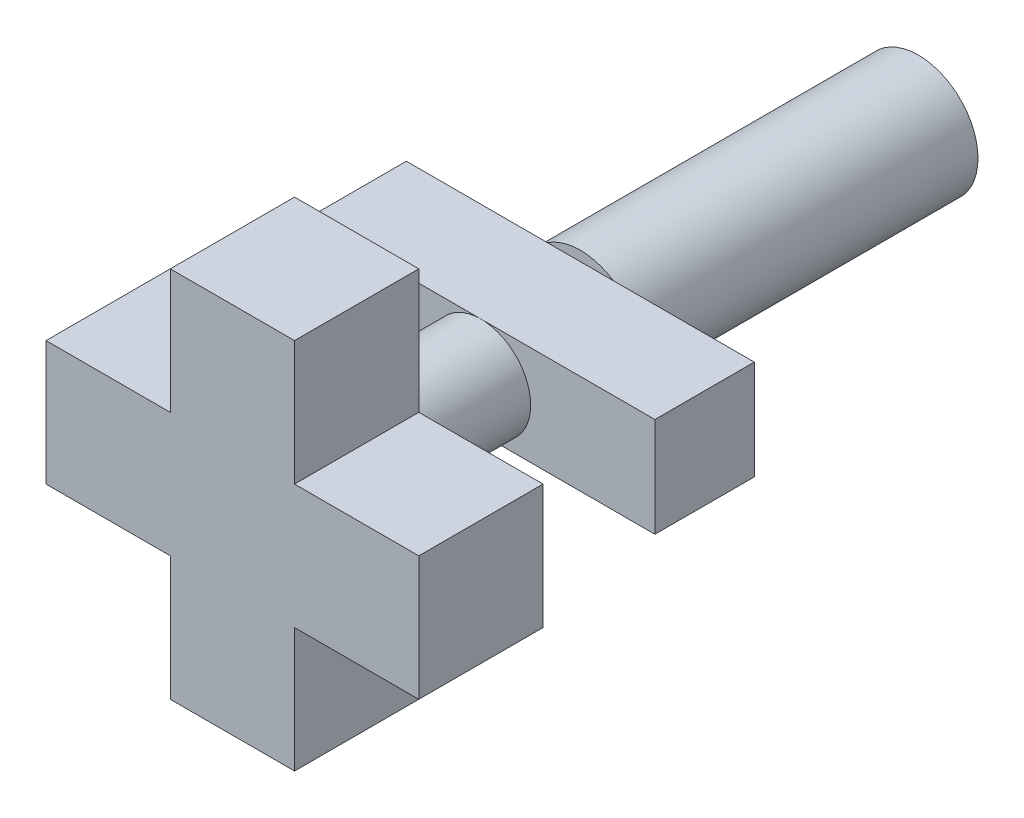
ISO-10303-21;
HEADER;
FILE_DESCRIPTION(('STEP AP214'),'2;1');
FILE_NAME('part.step','',(''),(''),'','','');
FILE_SCHEMA(('AUTOMOTIVE_DESIGN { 1 0 10303 214 1 1 1 1 }'));
ENDSEC;
DATA;
#1=APPLICATION_CONTEXT('core data for automotive mechanical design processes');
#2=APPLICATION_PROTOCOL_DEFINITION('international standard','automotive_design',2000,#1);
#3=PRODUCT_CONTEXT('',#1,'mechanical');
#4=PRODUCT('Part','Part','',(#3));
#5=PRODUCT_RELATED_PRODUCT_CATEGORY('part','',(#4));
#6=PRODUCT_DEFINITION_FORMATION('','',#4);
#7=PRODUCT_DEFINITION_CONTEXT('part definition',#1,'design');
#8=PRODUCT_DEFINITION('design','',#6,#7);
#9=PRODUCT_DEFINITION_SHAPE('','',#8);
#10=(LENGTH_UNIT() NAMED_UNIT(*) SI_UNIT(.MILLI.,.METRE.));
#11=(NAMED_UNIT(*) PLANE_ANGLE_UNIT() SI_UNIT($,.RADIAN.));
#12=(NAMED_UNIT(*) SI_UNIT($,.STERADIAN.) SOLID_ANGLE_UNIT());
#13=UNCERTAINTY_MEASURE_WITH_UNIT(LENGTH_MEASURE(1.E-05),#10,'distance_accuracy_value','');
#14=(GEOMETRIC_REPRESENTATION_CONTEXT(3) GLOBAL_UNCERTAINTY_ASSIGNED_CONTEXT((#13)) GLOBAL_UNIT_ASSIGNED_CONTEXT((#10,
#11,#12)) REPRESENTATION_CONTEXT('',''));
#15=CARTESIAN_POINT('',(0.,0.,0.));
#16=DIRECTION('',(0.,0.,1.));
#17=DIRECTION('',(1.,0.,0.));
#18=AXIS2_PLACEMENT_3D('',#15,#16,#17);
#19=CARTESIAN_POINT('',(0.,0.,22.352));
#20=DIRECTION('',(0.,0.,-1.));
#21=DIRECTION('',(-1.,0.,0.));
#22=AXIS2_PLACEMENT_3D('',#19,#20,#21);
#23=PLANE('',#22);
#24=CARTESIAN_POINT('',(0.,0.,22.352));
#25=DIRECTION('',(0.,0.,1.));
#26=DIRECTION('',(1.,0.,0.));
#27=AXIS2_PLACEMENT_3D('',#24,#25,#26);
#28=CIRCLE('',#27,2.54);
#29=CARTESIAN_POINT('',(0.,2.54,22.352));
#30=VERTEX_POINT('',#29);
#31=CARTESIAN_POINT('',(0.,-2.54,22.352));
#32=VERTEX_POINT('',#31);
#33=EDGE_CURVE('E61',#30,#32,#28,.T.);
#34=ORIENTED_EDGE('',*,*,#33,.F.);
#35=DIRECTION('',(-1.,0.,0.));
#36=VECTOR('',#35,1.);
#37=CARTESIAN_POINT('',(-8.89,2.54,22.352));
#38=LINE('',#37,#36);
#39=CARTESIAN_POINT('',(-8.89,2.54,22.352));
#40=VERTEX_POINT('',#39);
#41=EDGE_CURVE('E229',#30,#40,#38,.T.);
#42=ORIENTED_EDGE('',*,*,#41,.T.);
#43=DIRECTION('',(0.,-1.,0.));
#44=VECTOR('',#43,1.);
#45=CARTESIAN_POINT('',(-8.89,-2.54,22.352));
#46=LINE('',#45,#44);
#47=CARTESIAN_POINT('',(-8.89,-2.54,22.352));
#48=VERTEX_POINT('',#47);
#49=EDGE_CURVE('E234',#40,#48,#46,.T.);
#50=ORIENTED_EDGE('',*,*,#49,.T.);
#51=DIRECTION('',(1.,0.,0.));
#52=VECTOR('',#51,1.);
#53=CARTESIAN_POINT('',(-8.89,-2.54,22.352));
#54=LINE('',#53,#52);
#55=EDGE_CURVE('E238',#48,#32,#54,.T.);
#56=ORIENTED_EDGE('',*,*,#55,.T.);
#57=EDGE_LOOP('',(#34,#42,#50,#56));
#58=FACE_BOUND('',#57,.T.);
#59=ADVANCED_FACE('F49',(#58),#23,.F.);
#60=CARTESIAN_POINT('',(0.,0.,17.272));
#61=DIRECTION('',(0.,0.,1.));
#62=DIRECTION('',(1.,0.,0.));
#63=AXIS2_PLACEMENT_3D('',#60,#61,#62);
#64=PLANE('',#63);
#65=DIRECTION('',(1.,0.,0.));
#66=VECTOR('',#65,1.);
#67=CARTESIAN_POINT('',(-8.89,-2.54,17.272));
#68=LINE('',#67,#66);
#69=CARTESIAN_POINT('',(-1.68484539350054,-2.54,17.272));
#70=VERTEX_POINT('',#69);
#71=CARTESIAN_POINT('',(1.68484539350054,-2.54,17.272));
#72=VERTEX_POINT('',#71);
#73=EDGE_CURVE('E59',#70,#72,#68,.T.);
#74=ORIENTED_EDGE('',*,*,#73,.F.);
#75=CARTESIAN_POINT('',(0.,0.,17.272));
#76=DIRECTION('',(0.,0.,1.));
#77=DIRECTION('',(1.,0.,0.));
#78=AXIS2_PLACEMENT_3D('',#75,#76,#77);
#79=CIRCLE('',#78,3.048);
#80=EDGE_CURVE('E282',#70,#72,#79,.T.);
#81=ORIENTED_EDGE('',*,*,#80,.T.);
#82=EDGE_LOOP('',(#74,#81));
#83=FACE_BOUND('',#82,.T.);
#84=ADVANCED_FACE('F305',(#83),#64,.T.);
#85=CARTESIAN_POINT('',(0.,0.,17.272));
#86=DIRECTION('',(0.,0.,-1.));
#87=DIRECTION('',(-1.,0.,0.));
#88=AXIS2_PLACEMENT_3D('',#85,#86,#87);
#89=CYLINDRICAL_SURFACE('',#88,3.048);
#90=CARTESIAN_POINT('',(1.68484539350054,2.54,17.272));
#91=VERTEX_POINT('',#90);
#92=CARTESIAN_POINT('',(-1.68484539350054,2.54,17.272));
#93=VERTEX_POINT('',#92);
#94=EDGE_CURVE('E273',#91,#93,#79,.T.);
#95=ORIENTED_EDGE('',*,*,#94,.F.);
#96=EDGE_CURVE('E74',#72,#91,#79,.T.);
#97=ORIENTED_EDGE('',*,*,#96,.F.);
#98=ORIENTED_EDGE('',*,*,#80,.F.);
#99=EDGE_CURVE('E275',#93,#70,#79,.T.);
#100=ORIENTED_EDGE('',*,*,#99,.F.);
#101=EDGE_LOOP('',(#95,#97,#98,#100));
#102=FACE_BOUND('',#101,.T.);
#103=CARTESIAN_POINT('',(0.,0.,0.));
#104=DIRECTION('',(0.,0.,1.));
#105=DIRECTION('',(1.,0.,0.));
#106=AXIS2_PLACEMENT_3D('',#103,#104,#105);
#107=CIRCLE('',#106,3.048);
#108=CARTESIAN_POINT('',(3.048,0.,0.));
#109=VERTEX_POINT('',#108);
#110=EDGE_CURVE('E53',#109,#109,#107,.T.);
#111=ORIENTED_EDGE('',*,*,#110,.T.);
#112=EDGE_LOOP('',(#111));
#113=FACE_BOUND('',#112,.T.);
#114=ADVANCED_FACE('F51',(#102,#113),#89,.T.);
#115=DIRECTION('',(-1.,0.,0.));
#116=VECTOR('',#115,1.);
#117=CARTESIAN_POINT('',(-8.89,2.54,17.272));
#118=LINE('',#117,#116);
#119=EDGE_CURVE('E252',#91,#93,#118,.T.);
#120=ORIENTED_EDGE('',*,*,#119,.F.);
#121=ORIENTED_EDGE('',*,*,#94,.T.);
#122=EDGE_LOOP('',(#120,#121));
#123=FACE_BOUND('',#122,.T.);
#124=ADVANCED_FACE('F295',(#123),#64,.T.);
#125=CARTESIAN_POINT('',(0.,0.,0.));
#126=DIRECTION('',(0.,0.,1.));
#127=DIRECTION('',(1.,0.,0.));
#128=AXIS2_PLACEMENT_3D('',#125,#126,#127);
#129=PLANE('',#128);
#130=ORIENTED_EDGE('',*,*,#110,.F.);
#131=EDGE_LOOP('',(#130));
#132=FACE_BOUND('',#131,.T.);
#133=ADVANCED_FACE('F292',(#132),#129,.F.);
#134=CARTESIAN_POINT('',(0.,0.,17.272));
#135=DIRECTION('',(0.,0.,-1.));
#136=DIRECTION('',(-1.,0.,0.));
#137=AXIS2_PLACEMENT_3D('',#134,#135,#136);
#138=PLANE('',#137);
#139=CARTESIAN_POINT('',(-8.89,2.54,17.272));
#140=VERTEX_POINT('',#139);
#141=EDGE_CURVE('E246',#93,#140,#118,.T.);
#142=ORIENTED_EDGE('',*,*,#141,.F.);
#143=ORIENTED_EDGE('',*,*,#99,.T.);
#144=CARTESIAN_POINT('',(-8.89,-2.54,17.272));
#145=VERTEX_POINT('',#144);
#146=EDGE_CURVE('E230',#145,#70,#68,.T.);
#147=ORIENTED_EDGE('',*,*,#146,.F.);
#148=DIRECTION('',(0.,-1.,0.));
#149=VECTOR('',#148,1.);
#150=CARTESIAN_POINT('',(-8.89,-2.54,17.272));
#151=LINE('',#150,#149);
#152=EDGE_CURVE('E251',#140,#145,#151,.T.);
#153=ORIENTED_EDGE('',*,*,#152,.F.);
#154=EDGE_LOOP('',(#142,#143,#147,#153));
#155=FACE_BOUND('',#154,.T.);
#156=ADVANCED_FACE('F294',(#155),#138,.T.);
#157=CARTESIAN_POINT('',(8.89,-2.54,22.352));
#158=DIRECTION('',(-1.,0.,0.));
#159=DIRECTION('',(0.,0.,1.));
#160=AXIS2_PLACEMENT_3D('',#157,#158,#159);
#161=PLANE('',#160);
#162=DIRECTION('',(0.,1.,0.));
#163=VECTOR('',#162,1.);
#164=CARTESIAN_POINT('',(8.89,-2.54,17.272));
#165=LINE('',#164,#163);
#166=CARTESIAN_POINT('',(8.89,-2.54,17.272));
#167=VERTEX_POINT('',#166);
#168=CARTESIAN_POINT('',(8.89,2.54,17.272));
#169=VERTEX_POINT('',#168);
#170=EDGE_CURVE('E223',#167,#169,#165,.T.);
#171=ORIENTED_EDGE('',*,*,#170,.T.);
#172=DIRECTION('',(0.,0.,-1.));
#173=VECTOR('',#172,1.);
#174=CARTESIAN_POINT('',(8.89,2.54,22.352));
#175=LINE('',#174,#173);
#176=CARTESIAN_POINT('',(8.89,2.54,22.352));
#177=VERTEX_POINT('',#176);
#178=EDGE_CURVE('E270',#177,#169,#175,.T.);
#179=ORIENTED_EDGE('',*,*,#178,.F.);
#180=DIRECTION('',(0.,1.,0.));
#181=VECTOR('',#180,1.);
#182=CARTESIAN_POINT('',(8.89,-2.54,22.352));
#183=LINE('',#182,#181);
#184=CARTESIAN_POINT('',(8.89,-2.54,22.352));
#185=VERTEX_POINT('',#184);
#186=EDGE_CURVE('E225',#185,#177,#183,.T.);
#187=ORIENTED_EDGE('',*,*,#186,.F.);
#188=DIRECTION('',(0.,0.,-1.));
#189=VECTOR('',#188,1.);
#190=CARTESIAN_POINT('',(8.89,-2.54,22.352));
#191=LINE('',#190,#189);
#192=EDGE_CURVE('E242',#185,#167,#191,.T.);
#193=ORIENTED_EDGE('',*,*,#192,.T.);
#194=EDGE_LOOP('',(#171,#179,#187,#193));
#195=FACE_BOUND('',#194,.T.);
#196=ADVANCED_FACE('F300',(#195),#161,.F.);
#197=CARTESIAN_POINT('',(-8.89,2.54,22.352));
#198=DIRECTION('',(0.,-1.,0.));
#199=DIRECTION('',(0.,0.,-1.));
#200=AXIS2_PLACEMENT_3D('',#197,#198,#199);
#201=PLANE('',#200);
#202=EDGE_CURVE('E247',#169,#91,#118,.T.);
#203=ORIENTED_EDGE('',*,*,#202,.T.);
#204=ORIENTED_EDGE('',*,*,#119,.T.);
#205=ORIENTED_EDGE('',*,*,#141,.T.);
#206=DIRECTION('',(0.,0.,-1.));
#207=VECTOR('',#206,1.);
#208=CARTESIAN_POINT('',(-8.89,2.54,22.352));
#209=LINE('',#208,#207);
#210=EDGE_CURVE('E266',#40,#140,#209,.T.);
#211=ORIENTED_EDGE('',*,*,#210,.F.);
#212=ORIENTED_EDGE('',*,*,#41,.F.);
#213=EDGE_CURVE('E231',#177,#30,#38,.T.);
#214=ORIENTED_EDGE('',*,*,#213,.F.);
#215=ORIENTED_EDGE('',*,*,#178,.T.);
#216=EDGE_LOOP('',(#203,#204,#205,#211,#212,#214,#215));
#217=FACE_BOUND('',#216,.T.);
#218=ADVANCED_FACE('F329',(#217),#201,.F.);
#219=CARTESIAN_POINT('',(-8.89,-2.54,22.352));
#220=DIRECTION('',(1.,0.,0.));
#221=DIRECTION('',(0.,0.,-1.));
#222=AXIS2_PLACEMENT_3D('',#219,#220,#221);
#223=PLANE('',#222);
#224=ORIENTED_EDGE('',*,*,#152,.T.);
#225=DIRECTION('',(0.,0.,-1.));
#226=VECTOR('',#225,1.);
#227=CARTESIAN_POINT('',(-8.89,-2.54,22.352));
#228=LINE('',#227,#226);
#229=EDGE_CURVE('E262',#48,#145,#228,.T.);
#230=ORIENTED_EDGE('',*,*,#229,.F.);
#231=ORIENTED_EDGE('',*,*,#49,.F.);
#232=ORIENTED_EDGE('',*,*,#210,.T.);
#233=EDGE_LOOP('',(#224,#230,#231,#232));
#234=FACE_BOUND('',#233,.T.);
#235=ADVANCED_FACE('F323',(#234),#223,.F.);
#236=CARTESIAN_POINT('',(-8.89,-2.54,22.352));
#237=DIRECTION('',(0.,1.,0.));
#238=DIRECTION('',(0.,0.,1.));
#239=AXIS2_PLACEMENT_3D('',#236,#237,#238);
#240=PLANE('',#239);
#241=ORIENTED_EDGE('',*,*,#146,.T.);
#242=ORIENTED_EDGE('',*,*,#73,.T.);
#243=EDGE_CURVE('E255',#72,#167,#68,.T.);
#244=ORIENTED_EDGE('',*,*,#243,.T.);
#245=ORIENTED_EDGE('',*,*,#192,.F.);
#246=EDGE_CURVE('E237',#32,#185,#54,.T.);
#247=ORIENTED_EDGE('',*,*,#246,.F.);
#248=ORIENTED_EDGE('',*,*,#55,.F.);
#249=ORIENTED_EDGE('',*,*,#229,.T.);
#250=EDGE_LOOP('',(#241,#242,#244,#245,#247,#248,#249));
#251=FACE_BOUND('',#250,.T.);
#252=ADVANCED_FACE('F317',(#251),#240,.F.);
#253=EDGE_CURVE('E11',#32,#30,#28,.T.);
#254=ORIENTED_EDGE('',*,*,#253,.F.);
#255=ORIENTED_EDGE('',*,*,#246,.T.);
#256=ORIENTED_EDGE('',*,*,#186,.T.);
#257=ORIENTED_EDGE('',*,*,#213,.T.);
#258=EDGE_LOOP('',(#254,#255,#256,#257));
#259=FACE_BOUND('',#258,.T.);
#260=ADVANCED_FACE('F309',(#259),#23,.F.);
#261=ORIENTED_EDGE('',*,*,#243,.F.);
#262=ORIENTED_EDGE('',*,*,#96,.T.);
#263=ORIENTED_EDGE('',*,*,#202,.F.);
#264=ORIENTED_EDGE('',*,*,#170,.F.);
#265=EDGE_LOOP('',(#261,#262,#263,#264));
#266=FACE_BOUND('',#265,.T.);
#267=ADVANCED_FACE('F303',(#266),#138,.T.);
#268=CARTESIAN_POINT('',(0.,0.,28.702));
#269=DIRECTION('',(0.,0.,-1.));
#270=DIRECTION('',(-1.,0.,0.));
#271=AXIS2_PLACEMENT_3D('',#268,#269,#270);
#272=CYLINDRICAL_SURFACE('',#271,2.54);
#273=CARTESIAN_POINT('',(0.,0.,28.702));
#274=DIRECTION('',(0.,0.,1.));
#275=DIRECTION('',(1.,0.,0.));
#276=AXIS2_PLACEMENT_3D('',#273,#274,#275);
#277=CIRCLE('',#276,2.54);
#278=CARTESIAN_POINT('',(2.54,0.,28.702));
#279=VERTEX_POINT('',#278);
#280=EDGE_CURVE('E216',#279,#279,#277,.T.);
#281=ORIENTED_EDGE('',*,*,#280,.F.);
#282=EDGE_LOOP('',(#281));
#283=FACE_BOUND('',#282,.T.);
#284=ORIENTED_EDGE('',*,*,#33,.T.);
#285=ORIENTED_EDGE('',*,*,#253,.T.);
#286=EDGE_LOOP('',(#284,#285));
#287=FACE_BOUND('',#286,.T.);
#288=ADVANCED_FACE('F322',(#283,#287),#272,.T.);
#289=CARTESIAN_POINT('',(3.175,3.175,35.052));
#290=DIRECTION('',(0.,-1.,0.));
#291=DIRECTION('',(0.,0.,-1.));
#292=AXIS2_PLACEMENT_3D('',#289,#290,#291);
#293=PLANE('',#292);
#294=DIRECTION('',(-1.,0.,0.));
#295=VECTOR('',#294,1.);
#296=CARTESIAN_POINT('',(3.175,3.175,28.702));
#297=LINE('',#296,#295);
#298=CARTESIAN_POINT('',(9.525,3.175,28.702));
#299=VERTEX_POINT('',#298);
#300=CARTESIAN_POINT('',(3.175,3.175,28.702));
#301=VERTEX_POINT('',#300);
#302=EDGE_CURVE('E210',#299,#301,#297,.T.);
#303=ORIENTED_EDGE('',*,*,#302,.T.);
#304=DIRECTION('',(0.,0.,-1.));
#305=VECTOR('',#304,1.);
#306=CARTESIAN_POINT('',(3.175,3.175,35.052));
#307=LINE('',#306,#305);
#308=CARTESIAN_POINT('',(3.175,3.175,35.052));
#309=VERTEX_POINT('',#308);
#310=EDGE_CURVE('E188',#309,#301,#307,.T.);
#311=ORIENTED_EDGE('',*,*,#310,.F.);
#312=DIRECTION('',(-1.,0.,0.));
#313=VECTOR('',#312,1.);
#314=CARTESIAN_POINT('',(3.175,3.175,35.052));
#315=LINE('',#314,#313);
#316=CARTESIAN_POINT('',(9.525,3.175,35.052));
#317=VERTEX_POINT('',#316);
#318=EDGE_CURVE('E196',#317,#309,#315,.T.);
#319=ORIENTED_EDGE('',*,*,#318,.F.);
#320=DIRECTION('',(0.,0.,-1.));
#321=VECTOR('',#320,1.);
#322=CARTESIAN_POINT('',(9.525,3.175,35.052));
#323=LINE('',#322,#321);
#324=EDGE_CURVE('E713',#317,#299,#323,.T.);
#325=ORIENTED_EDGE('',*,*,#324,.T.);
#326=EDGE_LOOP('',(#303,#311,#319,#325));
#327=FACE_BOUND('',#326,.T.);
#328=ADVANCED_FACE('F208',(#327),#293,.F.);
#329=CARTESIAN_POINT('',(3.175,3.175,35.052));
#330=DIRECTION('',(-1.,0.,0.));
#331=DIRECTION('',(0.,-1.,0.));
#332=AXIS2_PLACEMENT_3D('',#329,#330,#331);
#333=PLANE('',#332);
#334=DIRECTION('',(0.,1.,0.));
#335=VECTOR('',#334,1.);
#336=CARTESIAN_POINT('',(3.175,3.175,28.702));
#337=LINE('',#336,#335);
#338=CARTESIAN_POINT('',(3.175,9.525,28.702));
#339=VERTEX_POINT('',#338);
#340=EDGE_CURVE('E676',#301,#339,#337,.T.);
#341=ORIENTED_EDGE('',*,*,#340,.T.);
#342=DIRECTION('',(0.,0.,-1.));
#343=VECTOR('',#342,1.);
#344=CARTESIAN_POINT('',(3.175,9.525,35.052));
#345=LINE('',#344,#343);
#346=CARTESIAN_POINT('',(3.175,9.525,35.052));
#347=VERTEX_POINT('',#346);
#348=EDGE_CURVE('E191',#347,#339,#345,.T.);
#349=ORIENTED_EDGE('',*,*,#348,.F.);
#350=DIRECTION('',(0.,1.,0.));
#351=VECTOR('',#350,1.);
#352=CARTESIAN_POINT('',(3.175,3.175,35.052));
#353=LINE('',#352,#351);
#354=EDGE_CURVE('E184',#309,#347,#353,.T.);
#355=ORIENTED_EDGE('',*,*,#354,.F.);
#356=ORIENTED_EDGE('',*,*,#310,.T.);
#357=EDGE_LOOP('',(#341,#349,#355,#356));
#358=FACE_BOUND('',#357,.T.);
#359=ADVANCED_FACE('F186',(#358),#333,.F.);
#360=CARTESIAN_POINT('',(-3.175,9.525,35.052));
#361=DIRECTION('',(0.,-1.,0.));
#362=DIRECTION('',(0.,0.,-1.));
#363=AXIS2_PLACEMENT_3D('',#360,#361,#362);
#364=PLANE('',#363);
#365=DIRECTION('',(-1.,0.,0.));
#366=VECTOR('',#365,1.);
#367=CARTESIAN_POINT('',(-3.175,9.525,28.702));
#368=LINE('',#367,#366);
#369=CARTESIAN_POINT('',(-3.175,9.525,28.702));
#370=VERTEX_POINT('',#369);
#371=EDGE_CURVE('E680',#339,#370,#368,.T.);
#372=ORIENTED_EDGE('',*,*,#371,.T.);
#373=DIRECTION('',(0.,0.,-1.));
#374=VECTOR('',#373,1.);
#375=CARTESIAN_POINT('',(-3.175,9.525,35.052));
#376=LINE('',#375,#374);
#377=CARTESIAN_POINT('',(-3.175,9.525,35.052));
#378=VERTEX_POINT('',#377);
#379=EDGE_CURVE('E217',#378,#370,#376,.T.);
#380=ORIENTED_EDGE('',*,*,#379,.F.);
#381=DIRECTION('',(-1.,0.,0.));
#382=VECTOR('',#381,1.);
#383=CARTESIAN_POINT('',(-3.175,9.525,35.052));
#384=LINE('',#383,#382);
#385=EDGE_CURVE('E195',#347,#378,#384,.T.);
#386=ORIENTED_EDGE('',*,*,#385,.F.);
#387=ORIENTED_EDGE('',*,*,#348,.T.);
#388=EDGE_LOOP('',(#372,#380,#386,#387));
#389=FACE_BOUND('',#388,.T.);
#390=ADVANCED_FACE('F368',(#389),#364,.F.);
#391=CARTESIAN_POINT('',(-3.175,3.175,35.052));
#392=DIRECTION('',(1.,0.,0.));
#393=DIRECTION('',(0.,1.,0.));
#394=AXIS2_PLACEMENT_3D('',#391,#392,#393);
#395=PLANE('',#394);
#396=DIRECTION('',(0.,-1.,0.));
#397=VECTOR('',#396,1.);
#398=CARTESIAN_POINT('',(-3.175,3.175,28.702));
#399=LINE('',#398,#397);
#400=CARTESIAN_POINT('',(-3.175,3.175,28.702));
#401=VERTEX_POINT('',#400);
#402=EDGE_CURVE('E687',#370,#401,#399,.T.);
#403=ORIENTED_EDGE('',*,*,#402,.T.);
#404=DIRECTION('',(0.,0.,-1.));
#405=VECTOR('',#404,1.);
#406=CARTESIAN_POINT('',(-3.175,3.175,35.052));
#407=LINE('',#406,#405);
#408=CARTESIAN_POINT('',(-3.175,3.175,35.052));
#409=VERTEX_POINT('',#408);
#410=EDGE_CURVE('E744',#409,#401,#407,.T.);
#411=ORIENTED_EDGE('',*,*,#410,.F.);
#412=DIRECTION('',(0.,-1.,0.));
#413=VECTOR('',#412,1.);
#414=CARTESIAN_POINT('',(-3.175,3.175,35.052));
#415=LINE('',#414,#413);
#416=EDGE_CURVE('E753',#378,#409,#415,.T.);
#417=ORIENTED_EDGE('',*,*,#416,.F.);
#418=ORIENTED_EDGE('',*,*,#379,.T.);
#419=EDGE_LOOP('',(#403,#411,#417,#418));
#420=FACE_BOUND('',#419,.T.);
#421=ADVANCED_FACE('F371',(#420),#395,.F.);
#422=CARTESIAN_POINT('',(-9.525,3.175,35.052));
#423=DIRECTION('',(0.,-1.,0.));
#424=DIRECTION('',(0.,0.,-1.));
#425=AXIS2_PLACEMENT_3D('',#422,#423,#424);
#426=PLANE('',#425);
#427=DIRECTION('',(-1.,0.,0.));
#428=VECTOR('',#427,1.);
#429=CARTESIAN_POINT('',(-9.525,3.175,28.702));
#430=LINE('',#429,#428);
#431=CARTESIAN_POINT('',(-9.525,3.175,28.702));
#432=VERTEX_POINT('',#431);
#433=EDGE_CURVE('E690',#401,#432,#430,.T.);
#434=ORIENTED_EDGE('',*,*,#433,.T.);
#435=DIRECTION('',(0.,0.,-1.));
#436=VECTOR('',#435,1.);
#437=CARTESIAN_POINT('',(-9.525,3.175,35.052));
#438=LINE('',#437,#436);
#439=CARTESIAN_POINT('',(-9.525,3.175,35.052));
#440=VERTEX_POINT('',#439);
#441=EDGE_CURVE('E740',#440,#432,#438,.T.);
#442=ORIENTED_EDGE('',*,*,#441,.F.);
#443=DIRECTION('',(-1.,0.,0.));
#444=VECTOR('',#443,1.);
#445=CARTESIAN_POINT('',(-9.525,3.175,35.052));
#446=LINE('',#445,#444);
#447=EDGE_CURVE('E765',#409,#440,#446,.T.);
#448=ORIENTED_EDGE('',*,*,#447,.F.);
#449=ORIENTED_EDGE('',*,*,#410,.T.);
#450=EDGE_LOOP('',(#434,#442,#448,#449));
#451=FACE_BOUND('',#450,.T.);
#452=ADVANCED_FACE('F375',(#451),#426,.F.);
#453=CARTESIAN_POINT('',(-9.525,-3.175,35.052));
#454=DIRECTION('',(1.,0.,0.));
#455=DIRECTION('',(0.,0.,-1.));
#456=AXIS2_PLACEMENT_3D('',#453,#454,#455);
#457=PLANE('',#456);
#458=DIRECTION('',(0.,-1.,0.));
#459=VECTOR('',#458,1.);
#460=CARTESIAN_POINT('',(-9.525,-3.175,28.702));
#461=LINE('',#460,#459);
#462=CARTESIAN_POINT('',(-9.525,-3.175,28.702));
#463=VERTEX_POINT('',#462);
#464=EDGE_CURVE('E693',#432,#463,#461,.T.);
#465=ORIENTED_EDGE('',*,*,#464,.T.);
#466=DIRECTION('',(0.,0.,-1.));
#467=VECTOR('',#466,1.);
#468=CARTESIAN_POINT('',(-9.525,-3.175,35.052));
#469=LINE('',#468,#467);
#470=CARTESIAN_POINT('',(-9.525,-3.175,35.052));
#471=VERTEX_POINT('',#470);
#472=EDGE_CURVE('E736',#471,#463,#469,.T.);
#473=ORIENTED_EDGE('',*,*,#472,.F.);
#474=DIRECTION('',(0.,-1.,0.));
#475=VECTOR('',#474,1.);
#476=CARTESIAN_POINT('',(-9.525,-3.175,35.052));
#477=LINE('',#476,#475);
#478=EDGE_CURVE('E761',#440,#471,#477,.T.);
#479=ORIENTED_EDGE('',*,*,#478,.F.);
#480=ORIENTED_EDGE('',*,*,#441,.T.);
#481=EDGE_LOOP('',(#465,#473,#479,#480));
#482=FACE_BOUND('',#481,.T.);
#483=ADVANCED_FACE('F379',(#482),#457,.F.);
#484=CARTESIAN_POINT('',(-9.525,-3.175,35.052));
#485=DIRECTION('',(0.,1.,0.));
#486=DIRECTION('',(0.,0.,1.));
#487=AXIS2_PLACEMENT_3D('',#484,#485,#486);
#488=PLANE('',#487);
#489=DIRECTION('',(1.,0.,0.));
#490=VECTOR('',#489,1.);
#491=CARTESIAN_POINT('',(-9.525,-3.175,28.702));
#492=LINE('',#491,#490);
#493=CARTESIAN_POINT('',(-3.175,-3.175,28.702));
#494=VERTEX_POINT('',#493);
#495=EDGE_CURVE('E696',#463,#494,#492,.T.);
#496=ORIENTED_EDGE('',*,*,#495,.T.);
#497=DIRECTION('',(0.,0.,-1.));
#498=VECTOR('',#497,1.);
#499=CARTESIAN_POINT('',(-3.175,-3.175,35.052));
#500=LINE('',#499,#498);
#501=CARTESIAN_POINT('',(-3.175,-3.175,35.052));
#502=VERTEX_POINT('',#501);
#503=EDGE_CURVE('E732',#502,#494,#500,.T.);
#504=ORIENTED_EDGE('',*,*,#503,.F.);
#505=DIRECTION('',(1.,0.,0.));
#506=VECTOR('',#505,1.);
#507=CARTESIAN_POINT('',(-9.525,-3.175,35.052));
#508=LINE('',#507,#506);
#509=EDGE_CURVE('E764',#471,#502,#508,.T.);
#510=ORIENTED_EDGE('',*,*,#509,.F.);
#511=ORIENTED_EDGE('',*,*,#472,.T.);
#512=EDGE_LOOP('',(#496,#504,#510,#511));
#513=FACE_BOUND('',#512,.T.);
#514=ADVANCED_FACE('F383',(#513),#488,.F.);
#515=CARTESIAN_POINT('',(-3.175,-9.525,35.052));
#516=DIRECTION('',(1.,0.,0.));
#517=DIRECTION('',(0.,1.,0.));
#518=AXIS2_PLACEMENT_3D('',#515,#516,#517);
#519=PLANE('',#518);
#520=DIRECTION('',(0.,-1.,0.));
#521=VECTOR('',#520,1.);
#522=CARTESIAN_POINT('',(-3.175,-9.525,28.702));
#523=LINE('',#522,#521);
#524=CARTESIAN_POINT('',(-3.175,-9.525,28.702));
#525=VERTEX_POINT('',#524);
#526=EDGE_CURVE('E699',#494,#525,#523,.T.);
#527=ORIENTED_EDGE('',*,*,#526,.T.);
#528=DIRECTION('',(0.,0.,-1.));
#529=VECTOR('',#528,1.);
#530=CARTESIAN_POINT('',(-3.175,-9.525,35.052));
#531=LINE('',#530,#529);
#532=CARTESIAN_POINT('',(-3.175,-9.525,35.052));
#533=VERTEX_POINT('',#532);
#534=EDGE_CURVE('E728',#533,#525,#531,.T.);
#535=ORIENTED_EDGE('',*,*,#534,.F.);
#536=DIRECTION('',(0.,-1.,0.));
#537=VECTOR('',#536,1.);
#538=CARTESIAN_POINT('',(-3.175,-9.525,35.052));
#539=LINE('',#538,#537);
#540=EDGE_CURVE('E769',#502,#533,#539,.T.);
#541=ORIENTED_EDGE('',*,*,#540,.F.);
#542=ORIENTED_EDGE('',*,*,#503,.T.);
#543=EDGE_LOOP('',(#527,#535,#541,#542));
#544=FACE_BOUND('',#543,.T.);
#545=ADVANCED_FACE('F387',(#544),#519,.F.);
#546=CARTESIAN_POINT('',(-3.175,-9.525,35.052));
#547=DIRECTION('',(0.,1.,0.));
#548=DIRECTION('',(0.,0.,1.));
#549=AXIS2_PLACEMENT_3D('',#546,#547,#548);
#550=PLANE('',#549);
#551=DIRECTION('',(1.,0.,0.));
#552=VECTOR('',#551,1.);
#553=CARTESIAN_POINT('',(-3.175,-9.525,28.702));
#554=LINE('',#553,#552);
#555=CARTESIAN_POINT('',(3.175,-9.525,28.702));
#556=VERTEX_POINT('',#555);
#557=EDGE_CURVE('E702',#525,#556,#554,.T.);
#558=ORIENTED_EDGE('',*,*,#557,.T.);
#559=DIRECTION('',(0.,0.,-1.));
#560=VECTOR('',#559,1.);
#561=CARTESIAN_POINT('',(3.175,-9.525,35.052));
#562=LINE('',#561,#560);
#563=CARTESIAN_POINT('',(3.175,-9.525,35.052));
#564=VERTEX_POINT('',#563);
#565=EDGE_CURVE('E724',#564,#556,#562,.T.);
#566=ORIENTED_EDGE('',*,*,#565,.F.);
#567=DIRECTION('',(1.,0.,0.));
#568=VECTOR('',#567,1.);
#569=CARTESIAN_POINT('',(-3.175,-9.525,35.052));
#570=LINE('',#569,#568);
#571=EDGE_CURVE('E776',#533,#564,#570,.T.);
#572=ORIENTED_EDGE('',*,*,#571,.F.);
#573=ORIENTED_EDGE('',*,*,#534,.T.);
#574=EDGE_LOOP('',(#558,#566,#572,#573));
#575=FACE_BOUND('',#574,.T.);
#576=ADVANCED_FACE('F391',(#575),#550,.F.);
#577=CARTESIAN_POINT('',(3.175,-9.525,35.052));
#578=DIRECTION('',(-1.,0.,0.));
#579=DIRECTION('',(0.,-1.,0.));
#580=AXIS2_PLACEMENT_3D('',#577,#578,#579);
#581=PLANE('',#580);
#582=DIRECTION('',(0.,1.,0.));
#583=VECTOR('',#582,1.);
#584=CARTESIAN_POINT('',(3.175,-9.525,28.702));
#585=LINE('',#584,#583);
#586=CARTESIAN_POINT('',(3.175,-3.175,28.702));
#587=VERTEX_POINT('',#586);
#588=EDGE_CURVE('E705',#556,#587,#585,.T.);
#589=ORIENTED_EDGE('',*,*,#588,.T.);
#590=DIRECTION('',(0.,0.,-1.));
#591=VECTOR('',#590,1.);
#592=CARTESIAN_POINT('',(3.175,-3.175,35.052));
#593=LINE('',#592,#591);
#594=CARTESIAN_POINT('',(3.175,-3.175,35.052));
#595=VERTEX_POINT('',#594);
#596=EDGE_CURVE('E720',#595,#587,#593,.T.);
#597=ORIENTED_EDGE('',*,*,#596,.F.);
#598=DIRECTION('',(0.,1.,0.));
#599=VECTOR('',#598,1.);
#600=CARTESIAN_POINT('',(3.175,-9.525,35.052));
#601=LINE('',#600,#599);
#602=EDGE_CURVE('E779',#564,#595,#601,.T.);
#603=ORIENTED_EDGE('',*,*,#602,.F.);
#604=ORIENTED_EDGE('',*,*,#565,.T.);
#605=EDGE_LOOP('',(#589,#597,#603,#604));
#606=FACE_BOUND('',#605,.T.);
#607=ADVANCED_FACE('F395',(#606),#581,.F.);
#608=CARTESIAN_POINT('',(3.175,-3.175,35.052));
#609=DIRECTION('',(0.,1.,0.));
#610=DIRECTION('',(-1.,0.,0.));
#611=AXIS2_PLACEMENT_3D('',#608,#609,#610);
#612=PLANE('',#611);
#613=DIRECTION('',(1.,0.,0.));
#614=VECTOR('',#613,1.);
#615=CARTESIAN_POINT('',(3.175,-3.175,28.702));
#616=LINE('',#615,#614);
#617=CARTESIAN_POINT('',(9.525,-3.175,28.702));
#618=VERTEX_POINT('',#617);
#619=EDGE_CURVE('E708',#587,#618,#616,.T.);
#620=ORIENTED_EDGE('',*,*,#619,.T.);
#621=DIRECTION('',(0.,0.,-1.));
#622=VECTOR('',#621,1.);
#623=CARTESIAN_POINT('',(9.525,-3.175,35.052));
#624=LINE('',#623,#622);
#625=CARTESIAN_POINT('',(9.525,-3.175,35.052));
#626=VERTEX_POINT('',#625);
#627=EDGE_CURVE('E716',#626,#618,#624,.T.);
#628=ORIENTED_EDGE('',*,*,#627,.F.);
#629=DIRECTION('',(1.,0.,0.));
#630=VECTOR('',#629,1.);
#631=CARTESIAN_POINT('',(3.175,-3.175,35.052));
#632=LINE('',#631,#630);
#633=EDGE_CURVE('E781',#595,#626,#632,.T.);
#634=ORIENTED_EDGE('',*,*,#633,.F.);
#635=ORIENTED_EDGE('',*,*,#596,.T.);
#636=EDGE_LOOP('',(#620,#628,#634,#635));
#637=FACE_BOUND('',#636,.T.);
#638=ADVANCED_FACE('F399',(#637),#612,.F.);
#639=CARTESIAN_POINT('',(9.525,-3.175,35.052));
#640=DIRECTION('',(-1.,0.,0.));
#641=DIRECTION('',(0.,0.,1.));
#642=AXIS2_PLACEMENT_3D('',#639,#640,#641);
#643=PLANE('',#642);
#644=DIRECTION('',(0.,1.,0.));
#645=VECTOR('',#644,1.);
#646=CARTESIAN_POINT('',(9.525,-3.175,28.702));
#647=LINE('',#646,#645);
#648=EDGE_CURVE('E206',#618,#299,#647,.T.);
#649=ORIENTED_EDGE('',*,*,#648,.T.);
#650=ORIENTED_EDGE('',*,*,#324,.F.);
#651=DIRECTION('',(0.,1.,0.));
#652=VECTOR('',#651,1.);
#653=CARTESIAN_POINT('',(9.525,-3.175,35.052));
#654=LINE('',#653,#652);
#655=EDGE_CURVE('E201',#626,#317,#654,.T.);
#656=ORIENTED_EDGE('',*,*,#655,.F.);
#657=ORIENTED_EDGE('',*,*,#627,.T.);
#658=EDGE_LOOP('',(#649,#650,#656,#657));
#659=FACE_BOUND('',#658,.T.);
#660=ADVANCED_FACE('F403',(#659),#643,.F.);
#661=CARTESIAN_POINT('',(0.,0.,35.052));
#662=DIRECTION('',(0.,0.,1.));
#663=DIRECTION('',(1.,0.,0.));
#664=AXIS2_PLACEMENT_3D('',#661,#662,#663);
#665=PLANE('',#664);
#666=ORIENTED_EDGE('',*,*,#318,.T.);
#667=ORIENTED_EDGE('',*,*,#354,.T.);
#668=ORIENTED_EDGE('',*,*,#385,.T.);
#669=ORIENTED_EDGE('',*,*,#416,.T.);
#670=ORIENTED_EDGE('',*,*,#447,.T.);
#671=ORIENTED_EDGE('',*,*,#478,.T.);
#672=ORIENTED_EDGE('',*,*,#509,.T.);
#673=ORIENTED_EDGE('',*,*,#540,.T.);
#674=ORIENTED_EDGE('',*,*,#571,.T.);
#675=ORIENTED_EDGE('',*,*,#602,.T.);
#676=ORIENTED_EDGE('',*,*,#633,.T.);
#677=ORIENTED_EDGE('',*,*,#655,.T.);
#678=EDGE_LOOP('',(#666,#667,#668,#669,#670,#671,#672,#673,#674,#675,#676,#677));
#679=FACE_BOUND('',#678,.T.);
#680=ADVANCED_FACE('F199',(#679),#665,.T.);
#681=CARTESIAN_POINT('',(0.,0.,28.702));
#682=DIRECTION('',(0.,0.,1.));
#683=DIRECTION('',(1.,0.,0.));
#684=AXIS2_PLACEMENT_3D('',#681,#682,#683);
#685=PLANE('',#684);
#686=ORIENTED_EDGE('',*,*,#280,.T.);
#687=EDGE_LOOP('',(#686));
#688=FACE_BOUND('',#687,.T.);
#689=ORIENTED_EDGE('',*,*,#302,.F.);
#690=ORIENTED_EDGE('',*,*,#648,.F.);
#691=ORIENTED_EDGE('',*,*,#619,.F.);
#692=ORIENTED_EDGE('',*,*,#588,.F.);
#693=ORIENTED_EDGE('',*,*,#557,.F.);
#694=ORIENTED_EDGE('',*,*,#526,.F.);
#695=ORIENTED_EDGE('',*,*,#495,.F.);
#696=ORIENTED_EDGE('',*,*,#464,.F.);
#697=ORIENTED_EDGE('',*,*,#433,.F.);
#698=ORIENTED_EDGE('',*,*,#402,.F.);
#699=ORIENTED_EDGE('',*,*,#371,.F.);
#700=ORIENTED_EDGE('',*,*,#340,.F.);
#701=EDGE_LOOP('',(#689,#690,#691,#692,#693,#694,#695,#696,#697,#698,#699,#700));
#702=FACE_BOUND('',#701,.T.);
#703=ADVANCED_FACE('F408',(#688,#702),#685,.F.);
#704=CLOSED_SHELL('',(#59,#84,#114,#124,#133,#156,#196,#218,#235,#252,#260,#267,#288,#328,#359,
#390,#421,#452,#483,#514,#545,#576,#607,#638,#660,#680,#703));
#705=MANIFOLD_SOLID_BREP('B2',#704);
#706=ADVANCED_BREP_SHAPE_REPRESENTATION('',(#18,#705),#14);
#707=SHAPE_DEFINITION_REPRESENTATION(#9,#706);
ENDSEC;
END-ISO-10303-21;
